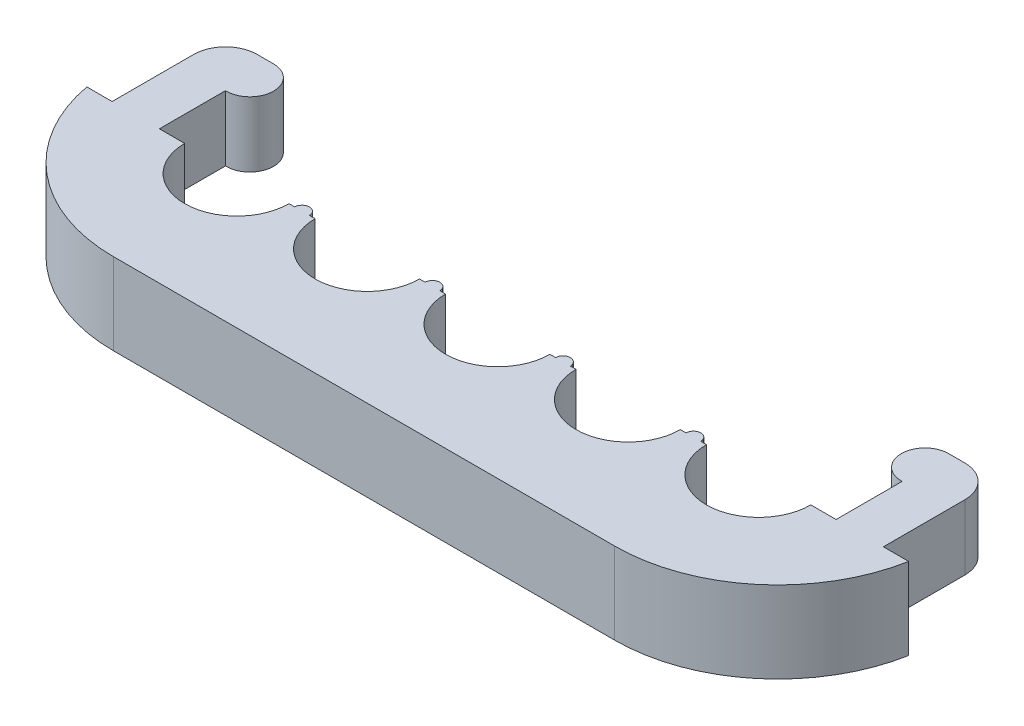
ISO-10303-21;
HEADER;
FILE_DESCRIPTION(('STEP AP214'),'2;1');
FILE_NAME('part.step','',(''),(''),'','','');
FILE_SCHEMA(('AUTOMOTIVE_DESIGN { 1 0 10303 214 1 1 1 1 }'));
ENDSEC;
DATA;
#1=APPLICATION_CONTEXT('core data for automotive mechanical design processes');
#2=APPLICATION_PROTOCOL_DEFINITION('international standard','automotive_design',2000,#1);
#3=PRODUCT_CONTEXT('',#1,'mechanical');
#4=PRODUCT('Part','Part','',(#3));
#5=PRODUCT_RELATED_PRODUCT_CATEGORY('part','',(#4));
#6=PRODUCT_DEFINITION_FORMATION('','',#4);
#7=PRODUCT_DEFINITION_CONTEXT('part definition',#1,'design');
#8=PRODUCT_DEFINITION('design','',#6,#7);
#9=PRODUCT_DEFINITION_SHAPE('','',#8);
#10=(LENGTH_UNIT() NAMED_UNIT(*) SI_UNIT(.MILLI.,.METRE.));
#11=(NAMED_UNIT(*) PLANE_ANGLE_UNIT() SI_UNIT($,.RADIAN.));
#12=(NAMED_UNIT(*) SI_UNIT($,.STERADIAN.) SOLID_ANGLE_UNIT());
#13=UNCERTAINTY_MEASURE_WITH_UNIT(LENGTH_MEASURE(1.E-05),#10,'distance_accuracy_value','');
#14=(GEOMETRIC_REPRESENTATION_CONTEXT(3) GLOBAL_UNCERTAINTY_ASSIGNED_CONTEXT((#13)) GLOBAL_UNIT_ASSIGNED_CONTEXT((#10,
#11,#12)) REPRESENTATION_CONTEXT('',''));
#15=CARTESIAN_POINT('',(0.,0.,0.));
#16=DIRECTION('',(0.,0.,1.));
#17=DIRECTION('',(1.,0.,0.));
#18=AXIS2_PLACEMENT_3D('',#15,#16,#17);
#19=CARTESIAN_POINT('',(-12.8,2.5,0.));
#20=DIRECTION('',(0.,0.,1.));
#21=DIRECTION('',(1.,0.,0.));
#22=AXIS2_PLACEMENT_3D('',#19,#20,#21);
#23=PLANE('',#22);
#24=DIRECTION('',(-1.,0.,0.));
#25=VECTOR('',#24,1.);
#26=CARTESIAN_POINT('',(-12.8,-2.5,0.));
#27=LINE('',#26,#25);
#28=CARTESIAN_POINT('',(-11.2,-2.5,0.));
#29=VERTEX_POINT('',#28);
#30=CARTESIAN_POINT('',(-11.55,-2.5,0.));
#31=VERTEX_POINT('',#30);
#32=EDGE_CURVE('E379',#29,#31,#27,.T.);
#33=ORIENTED_EDGE('',*,*,#32,.T.);
#34=DIRECTION('',(0.,1.,0.));
#35=VECTOR('',#34,1.);
#36=CARTESIAN_POINT('',(-11.55,-2.5,0.));
#37=LINE('',#36,#35);
#38=CARTESIAN_POINT('',(-11.55,2.5,0.));
#39=VERTEX_POINT('',#38);
#40=EDGE_CURVE('E454',#31,#39,#37,.T.);
#41=ORIENTED_EDGE('',*,*,#40,.T.);
#42=DIRECTION('',(-1.,0.,0.));
#43=VECTOR('',#42,1.);
#44=CARTESIAN_POINT('',(-12.8,2.5,0.));
#45=LINE('',#44,#43);
#46=CARTESIAN_POINT('',(-11.2,2.5,0.));
#47=VERTEX_POINT('',#46);
#48=EDGE_CURVE('E408',#47,#39,#45,.T.);
#49=ORIENTED_EDGE('',*,*,#48,.F.);
#50=DIRECTION('',(0.,-1.,0.));
#51=VECTOR('',#50,1.);
#52=CARTESIAN_POINT('',(-11.2,2.5,0.));
#53=LINE('',#52,#51);
#54=EDGE_CURVE('E331',#47,#29,#53,.T.);
#55=ORIENTED_EDGE('',*,*,#54,.T.);
#56=EDGE_LOOP('',(#33,#41,#49,#55));
#57=FACE_BOUND('',#56,.T.);
#58=ADVANCED_FACE('F39',(#57),#23,.F.);
#59=CARTESIAN_POINT('',(11.2,2.5,0.));
#60=DIRECTION('',(0.,0.,1.));
#61=DIRECTION('',(1.,0.,0.));
#62=AXIS2_PLACEMENT_3D('',#59,#60,#61);
#63=PLANE('',#62);
#64=DIRECTION('',(-1.,0.,0.));
#65=VECTOR('',#64,1.);
#66=CARTESIAN_POINT('',(11.2,-2.5,0.));
#67=LINE('',#66,#65);
#68=CARTESIAN_POINT('',(12.8,-2.5,0.));
#69=VERTEX_POINT('',#68);
#70=CARTESIAN_POINT('',(12.45,-2.5,0.));
#71=VERTEX_POINT('',#70);
#72=EDGE_CURVE('E274',#69,#71,#67,.T.);
#73=ORIENTED_EDGE('',*,*,#72,.T.);
#74=DIRECTION('',(0.,1.,0.));
#75=VECTOR('',#74,1.);
#76=CARTESIAN_POINT('',(12.45,-2.5,0.));
#77=LINE('',#76,#75);
#78=CARTESIAN_POINT('',(12.45,2.5,0.));
#79=VERTEX_POINT('',#78);
#80=EDGE_CURVE('E260',#71,#79,#77,.T.);
#81=ORIENTED_EDGE('',*,*,#80,.T.);
#82=DIRECTION('',(-1.,0.,0.));
#83=VECTOR('',#82,1.);
#84=CARTESIAN_POINT('',(11.2,2.5,0.));
#85=LINE('',#84,#83);
#86=CARTESIAN_POINT('',(12.8,2.5,0.));
#87=VERTEX_POINT('',#86);
#88=EDGE_CURVE('E398',#87,#79,#85,.T.);
#89=ORIENTED_EDGE('',*,*,#88,.F.);
#90=DIRECTION('',(0.,-1.,0.));
#91=VECTOR('',#90,1.);
#92=CARTESIAN_POINT('',(12.8,2.5,0.));
#93=LINE('',#92,#91);
#94=EDGE_CURVE('E283',#87,#69,#93,.T.);
#95=ORIENTED_EDGE('',*,*,#94,.T.);
#96=EDGE_LOOP('',(#73,#81,#89,#95));
#97=FACE_BOUND('',#96,.T.);
#98=ADVANCED_FACE('F276',(#97),#63,.F.);
#99=CARTESIAN_POINT('',(3.2,2.5,0.));
#100=DIRECTION('',(0.,0.,1.));
#101=DIRECTION('',(1.,0.,0.));
#102=AXIS2_PLACEMENT_3D('',#99,#100,#101);
#103=PLANE('',#102);
#104=DIRECTION('',(-1.,0.,0.));
#105=VECTOR('',#104,1.);
#106=CARTESIAN_POINT('',(3.2,-2.5,0.));
#107=LINE('',#106,#105);
#108=CARTESIAN_POINT('',(4.8,-2.5,0.));
#109=VERTEX_POINT('',#108);
#110=CARTESIAN_POINT('',(4.45,-2.5,0.));
#111=VERTEX_POINT('',#110);
#112=EDGE_CURVE('E287',#109,#111,#107,.T.);
#113=ORIENTED_EDGE('',*,*,#112,.T.);
#114=DIRECTION('',(0.,1.,0.));
#115=VECTOR('',#114,1.);
#116=CARTESIAN_POINT('',(4.45,-2.5,0.));
#117=LINE('',#116,#115);
#118=CARTESIAN_POINT('',(4.45,2.5,0.));
#119=VERTEX_POINT('',#118);
#120=EDGE_CURVE('E513',#111,#119,#117,.T.);
#121=ORIENTED_EDGE('',*,*,#120,.T.);
#122=DIRECTION('',(-1.,0.,0.));
#123=VECTOR('',#122,1.);
#124=CARTESIAN_POINT('',(3.2,2.5,0.));
#125=LINE('',#124,#123);
#126=CARTESIAN_POINT('',(4.8,2.5,0.));
#127=VERTEX_POINT('',#126);
#128=EDGE_CURVE('E392',#127,#119,#125,.T.);
#129=ORIENTED_EDGE('',*,*,#128,.F.);
#130=DIRECTION('',(0.,-1.,0.));
#131=VECTOR('',#130,1.);
#132=CARTESIAN_POINT('',(4.8,2.5,0.));
#133=LINE('',#132,#131);
#134=EDGE_CURVE('E309',#127,#109,#133,.T.);
#135=ORIENTED_EDGE('',*,*,#134,.T.);
#136=EDGE_LOOP('',(#113,#121,#129,#135));
#137=FACE_BOUND('',#136,.T.);
#138=ADVANCED_FACE('F588',(#137),#103,.F.);
#139=CARTESIAN_POINT('',(-4.8,2.5,0.));
#140=DIRECTION('',(0.,0.,1.));
#141=DIRECTION('',(1.,0.,0.));
#142=AXIS2_PLACEMENT_3D('',#139,#140,#141);
#143=PLANE('',#142);
#144=DIRECTION('',(-1.,0.,0.));
#145=VECTOR('',#144,1.);
#146=CARTESIAN_POINT('',(-4.8,-2.5,0.));
#147=LINE('',#146,#145);
#148=CARTESIAN_POINT('',(-3.2,-2.5,0.));
#149=VERTEX_POINT('',#148);
#150=CARTESIAN_POINT('',(-3.55,-2.5,0.));
#151=VERTEX_POINT('',#150);
#152=EDGE_CURVE('E298',#149,#151,#147,.T.);
#153=ORIENTED_EDGE('',*,*,#152,.T.);
#154=DIRECTION('',(0.,1.,0.));
#155=VECTOR('',#154,1.);
#156=CARTESIAN_POINT('',(-3.55,-2.5,0.));
#157=LINE('',#156,#155);
#158=CARTESIAN_POINT('',(-3.55,2.5,0.));
#159=VERTEX_POINT('',#158);
#160=EDGE_CURVE('E508',#151,#159,#157,.T.);
#161=ORIENTED_EDGE('',*,*,#160,.T.);
#162=DIRECTION('',(-1.,0.,0.));
#163=VECTOR('',#162,1.);
#164=CARTESIAN_POINT('',(-4.8,2.5,0.));
#165=LINE('',#164,#163);
#166=CARTESIAN_POINT('',(-3.2,2.5,0.));
#167=VERTEX_POINT('',#166);
#168=EDGE_CURVE('E302',#167,#159,#165,.T.);
#169=ORIENTED_EDGE('',*,*,#168,.F.);
#170=DIRECTION('',(0.,-1.,0.));
#171=VECTOR('',#170,1.);
#172=CARTESIAN_POINT('',(-3.2,2.5,0.));
#173=LINE('',#172,#171);
#174=EDGE_CURVE('E303',#167,#149,#173,.T.);
#175=ORIENTED_EDGE('',*,*,#174,.T.);
#176=EDGE_LOOP('',(#153,#161,#169,#175));
#177=FACE_BOUND('',#176,.T.);
#178=ADVANCED_FACE('F571',(#177),#143,.F.);
#179=CARTESIAN_POINT('',(-25.2,2.5,0.));
#180=DIRECTION('',(0.,0.,1.));
#181=DIRECTION('',(1.,0.,0.));
#182=AXIS2_PLACEMENT_3D('',#179,#180,#181);
#183=PLANE('',#182);
#184=DIRECTION('',(0.,1.,0.));
#185=VECTOR('',#184,1.);
#186=CARTESIAN_POINT('',(-23.65,-1.5,0.));
#187=LINE('',#186,#185);
#188=CARTESIAN_POINT('',(-23.65,-1.5,0.));
#189=VERTEX_POINT('',#188);
#190=CARTESIAN_POINT('',(-23.65,2.5,0.));
#191=VERTEX_POINT('',#190);
#192=EDGE_CURVE('E456',#189,#191,#187,.T.);
#193=ORIENTED_EDGE('',*,*,#192,.F.);
#194=DIRECTION('',(1.,0.,0.));
#195=VECTOR('',#194,1.);
#196=CARTESIAN_POINT('',(-23.65,-1.5,0.));
#197=LINE('',#196,#195);
#198=CARTESIAN_POINT('',(-20.75,-1.5,0.));
#199=VERTEX_POINT('',#198);
#200=EDGE_CURVE('E422',#189,#199,#197,.T.);
#201=ORIENTED_EDGE('',*,*,#200,.T.);
#202=DIRECTION('',(0.,1.,0.));
#203=VECTOR('',#202,1.);
#204=CARTESIAN_POINT('',(-20.75,-1.5,0.));
#205=LINE('',#204,#203);
#206=CARTESIAN_POINT('',(-20.75,2.5,0.));
#207=VERTEX_POINT('',#206);
#208=EDGE_CURVE('E459',#199,#207,#205,.T.);
#209=ORIENTED_EDGE('',*,*,#208,.T.);
#210=DIRECTION('',(-1.,0.,0.));
#211=VECTOR('',#210,1.);
#212=CARTESIAN_POINT('',(-25.2,2.5,0.));
#213=LINE('',#212,#211);
#214=CARTESIAN_POINT('',(-19.2,2.5,0.));
#215=VERTEX_POINT('',#214);
#216=EDGE_CURVE('E404',#215,#207,#213,.T.);
#217=ORIENTED_EDGE('',*,*,#216,.F.);
#218=DIRECTION('',(0.,-1.,0.));
#219=VECTOR('',#218,1.);
#220=CARTESIAN_POINT('',(-19.2,2.5,0.));
#221=LINE('',#220,#219);
#222=CARTESIAN_POINT('',(-19.2,-2.5,0.));
#223=VERTEX_POINT('',#222);
#224=EDGE_CURVE('E328',#215,#223,#221,.T.);
#225=ORIENTED_EDGE('',*,*,#224,.T.);
#226=DIRECTION('',(-1.,0.,0.));
#227=VECTOR('',#226,1.);
#228=CARTESIAN_POINT('',(-25.2,-2.5,0.));
#229=LINE('',#228,#227);
#230=CARTESIAN_POINT('',(-25.2,-2.5,0.));
#231=VERTEX_POINT('',#230);
#232=EDGE_CURVE('E373',#223,#231,#229,.T.);
#233=ORIENTED_EDGE('',*,*,#232,.T.);
#234=DIRECTION('',(0.,-1.,0.));
#235=VECTOR('',#234,1.);
#236=CARTESIAN_POINT('',(-25.2,2.5,0.));
#237=LINE('',#236,#235);
#238=CARTESIAN_POINT('',(-25.2,2.5,0.));
#239=VERTEX_POINT('',#238);
#240=EDGE_CURVE('E324',#239,#231,#237,.T.);
#241=ORIENTED_EDGE('',*,*,#240,.F.);
#242=EDGE_CURVE('E410',#191,#239,#213,.T.);
#243=ORIENTED_EDGE('',*,*,#242,.F.);
#244=EDGE_LOOP('',(#193,#201,#209,#217,#225,#233,#241,#243));
#245=FACE_BOUND('',#244,.T.);
#246=ADVANCED_FACE('F547',(#245),#183,.F.);
#247=CARTESIAN_POINT('',(19.2,2.5,0.));
#248=DIRECTION('',(0.,0.,1.));
#249=DIRECTION('',(1.,0.,0.));
#250=AXIS2_PLACEMENT_3D('',#247,#248,#249);
#251=PLANE('',#250);
#252=DIRECTION('',(0.,1.,0.));
#253=VECTOR('',#252,1.);
#254=CARTESIAN_POINT('',(20.75,-1.5,0.));
#255=LINE('',#254,#253);
#256=CARTESIAN_POINT('',(20.75,-1.5,0.));
#257=VERTEX_POINT('',#256);
#258=CARTESIAN_POINT('',(20.75,2.5,0.));
#259=VERTEX_POINT('',#258);
#260=EDGE_CURVE('E462',#257,#259,#255,.T.);
#261=ORIENTED_EDGE('',*,*,#260,.F.);
#262=DIRECTION('',(1.,0.,0.));
#263=VECTOR('',#262,1.);
#264=CARTESIAN_POINT('',(23.65,-1.5,0.));
#265=LINE('',#264,#263);
#266=CARTESIAN_POINT('',(23.65,-1.5,0.));
#267=VERTEX_POINT('',#266);
#268=EDGE_CURVE('E500',#257,#267,#265,.T.);
#269=ORIENTED_EDGE('',*,*,#268,.T.);
#270=DIRECTION('',(0.,1.,0.));
#271=VECTOR('',#270,1.);
#272=CARTESIAN_POINT('',(23.65,-1.5,0.));
#273=LINE('',#272,#271);
#274=CARTESIAN_POINT('',(23.65,2.5,0.));
#275=VERTEX_POINT('',#274);
#276=EDGE_CURVE('E365',#267,#275,#273,.T.);
#277=ORIENTED_EDGE('',*,*,#276,.T.);
#278=DIRECTION('',(-1.,0.,0.));
#279=VECTOR('',#278,1.);
#280=CARTESIAN_POINT('',(19.2,2.5,0.));
#281=LINE('',#280,#279);
#282=CARTESIAN_POINT('',(25.2,2.5,0.));
#283=VERTEX_POINT('',#282);
#284=EDGE_CURVE('E354',#283,#275,#281,.T.);
#285=ORIENTED_EDGE('',*,*,#284,.F.);
#286=DIRECTION('',(0.,-1.,0.));
#287=VECTOR('',#286,1.);
#288=CARTESIAN_POINT('',(25.2,2.5,0.));
#289=LINE('',#288,#287);
#290=CARTESIAN_POINT('',(25.2,-2.5,0.));
#291=VERTEX_POINT('',#290);
#292=EDGE_CURVE('E318',#283,#291,#289,.T.);
#293=ORIENTED_EDGE('',*,*,#292,.T.);
#294=DIRECTION('',(-1.,0.,0.));
#295=VECTOR('',#294,1.);
#296=CARTESIAN_POINT('',(19.2,-2.5,0.));
#297=LINE('',#296,#295);
#298=CARTESIAN_POINT('',(19.2,-2.5,0.));
#299=VERTEX_POINT('',#298);
#300=EDGE_CURVE('E367',#291,#299,#297,.T.);
#301=ORIENTED_EDGE('',*,*,#300,.T.);
#302=DIRECTION('',(0.,-1.,0.));
#303=VECTOR('',#302,1.);
#304=CARTESIAN_POINT('',(19.2,2.5,0.));
#305=LINE('',#304,#303);
#306=CARTESIAN_POINT('',(19.2,2.5,0.));
#307=VERTEX_POINT('',#306);
#308=EDGE_CURVE('E320',#307,#299,#305,.T.);
#309=ORIENTED_EDGE('',*,*,#308,.F.);
#310=EDGE_CURVE('E364',#259,#307,#281,.T.);
#311=ORIENTED_EDGE('',*,*,#310,.F.);
#312=EDGE_LOOP('',(#261,#269,#277,#285,#293,#301,#309,#311));
#313=FACE_BOUND('',#312,.T.);
#314=ADVANCED_FACE('F360',(#313),#251,.F.);
#315=CARTESIAN_POINT('',(-8.,2.5,0.));
#316=DIRECTION('',(0.,-1.,0.));
#317=DIRECTION('',(0.,0.,-1.));
#318=AXIS2_PLACEMENT_3D('',#315,#316,#317);
#319=CYLINDRICAL_SURFACE('',#318,3.2);
#320=CARTESIAN_POINT('',(-8.,-2.5,0.));
#321=DIRECTION('',(0.,-1.,0.));
#322=DIRECTION('',(0.,0.,1.));
#323=AXIS2_PLACEMENT_3D('',#320,#321,#322);
#324=CIRCLE('',#323,3.2);
#325=CARTESIAN_POINT('',(-4.8,-2.5,0.));
#326=VERTEX_POINT('',#325);
#327=EDGE_CURVE('E381',#326,#29,#324,.T.);
#328=ORIENTED_EDGE('',*,*,#327,.T.);
#329=ORIENTED_EDGE('',*,*,#54,.F.);
#330=CARTESIAN_POINT('',(-8.,2.5,0.));
#331=DIRECTION('',(0.,-1.,0.));
#332=DIRECTION('',(0.,0.,1.));
#333=AXIS2_PLACEMENT_3D('',#330,#331,#332);
#334=CIRCLE('',#333,3.2);
#335=CARTESIAN_POINT('',(-4.8,2.5,0.));
#336=VERTEX_POINT('',#335);
#337=EDGE_CURVE('E299',#336,#47,#334,.T.);
#338=ORIENTED_EDGE('',*,*,#337,.F.);
#339=DIRECTION('',(0.,-1.,0.));
#340=VECTOR('',#339,1.);
#341=CARTESIAN_POINT('',(-4.8,2.5,0.));
#342=LINE('',#341,#340);
#343=EDGE_CURVE('E297',#336,#326,#342,.T.);
#344=ORIENTED_EDGE('',*,*,#343,.T.);
#345=EDGE_LOOP('',(#328,#329,#338,#344));
#346=FACE_BOUND('',#345,.T.);
#347=ADVANCED_FACE('F559',(#346),#319,.F.);
#348=CARTESIAN_POINT('',(-12.45,2.5,0.));
#349=VERTEX_POINT('',#348);
#350=CARTESIAN_POINT('',(-12.8,2.5,0.));
#351=VERTEX_POINT('',#350);
#352=EDGE_CURVE('E414',#349,#351,#45,.T.);
#353=ORIENTED_EDGE('',*,*,#352,.F.);
#354=DIRECTION('',(0.,1.,0.));
#355=VECTOR('',#354,1.);
#356=CARTESIAN_POINT('',(-12.45,-2.5,0.));
#357=LINE('',#356,#355);
#358=CARTESIAN_POINT('',(-12.45,-2.5,0.));
#359=VERTEX_POINT('',#358);
#360=EDGE_CURVE('E506',#349,#359,#357,.F.);
#361=ORIENTED_EDGE('',*,*,#360,.T.);
#362=CARTESIAN_POINT('',(-12.8,-2.5,0.));
#363=VERTEX_POINT('',#362);
#364=EDGE_CURVE('E384',#359,#363,#27,.T.);
#365=ORIENTED_EDGE('',*,*,#364,.T.);
#366=DIRECTION('',(0.,-1.,0.));
#367=VECTOR('',#366,1.);
#368=CARTESIAN_POINT('',(-12.8,2.5,0.));
#369=LINE('',#368,#367);
#370=EDGE_CURVE('E330',#351,#363,#369,.T.);
#371=ORIENTED_EDGE('',*,*,#370,.F.);
#372=EDGE_LOOP('',(#353,#361,#365,#371));
#373=FACE_BOUND('',#372,.T.);
#374=ADVANCED_FACE('F536',(#373),#23,.F.);
#375=CARTESIAN_POINT('',(-16.,2.5,0.));
#376=DIRECTION('',(0.,-1.,0.));
#377=DIRECTION('',(0.,0.,-1.));
#378=AXIS2_PLACEMENT_3D('',#375,#376,#377);
#379=CYLINDRICAL_SURFACE('',#378,3.2);
#380=CARTESIAN_POINT('',(-16.,-2.5,0.));
#381=DIRECTION('',(0.,-1.,0.));
#382=DIRECTION('',(0.,0.,1.));
#383=AXIS2_PLACEMENT_3D('',#380,#381,#382);
#384=CIRCLE('',#383,3.2);
#385=EDGE_CURVE('E376',#363,#223,#384,.T.);
#386=ORIENTED_EDGE('',*,*,#385,.T.);
#387=ORIENTED_EDGE('',*,*,#224,.F.);
#388=CARTESIAN_POINT('',(-16.,2.5,0.));
#389=DIRECTION('',(0.,-1.,0.));
#390=DIRECTION('',(0.,0.,1.));
#391=AXIS2_PLACEMENT_3D('',#388,#389,#390);
#392=CIRCLE('',#391,3.2);
#393=EDGE_CURVE('E409',#351,#215,#392,.T.);
#394=ORIENTED_EDGE('',*,*,#393,.F.);
#395=ORIENTED_EDGE('',*,*,#370,.T.);
#396=EDGE_LOOP('',(#386,#387,#394,#395));
#397=FACE_BOUND('',#396,.T.);
#398=ADVANCED_FACE('F541',(#397),#379,.F.);
#399=CARTESIAN_POINT('',(25.2,2.5,8.2));
#400=DIRECTION('',(0.,0.,-1.));
#401=DIRECTION('',(-1.,0.,0.));
#402=AXIS2_PLACEMENT_3D('',#399,#400,#401);
#403=PLANE('',#402);
#404=DIRECTION('',(1.,0.,0.));
#405=VECTOR('',#404,1.);
#406=CARTESIAN_POINT('',(25.2,2.5,8.2));
#407=LINE('',#406,#405);
#408=CARTESIAN_POINT('',(-15.3633338981136,2.5,8.2));
#409=VERTEX_POINT('',#408);
#410=CARTESIAN_POINT('',(15.3633338981137,2.5,8.2));
#411=VERTEX_POINT('',#410);
#412=EDGE_CURVE('E353',#409,#411,#407,.T.);
#413=ORIENTED_EDGE('',*,*,#412,.F.);
#414=DIRECTION('',(0.,-1.,0.));
#415=VECTOR('',#414,1.);
#416=CARTESIAN_POINT('',(-15.3633338981136,2.5,8.2));
#417=LINE('',#416,#415);
#418=CARTESIAN_POINT('',(-15.3633338981136,-2.5,8.2));
#419=VERTEX_POINT('',#418);
#420=EDGE_CURVE('E340',#409,#419,#417,.T.);
#421=ORIENTED_EDGE('',*,*,#420,.T.);
#422=DIRECTION('',(1.,0.,0.));
#423=VECTOR('',#422,1.);
#424=CARTESIAN_POINT('',(25.2,-2.5,8.2));
#425=LINE('',#424,#423);
#426=CARTESIAN_POINT('',(15.3633338981137,-2.5,8.2));
#427=VERTEX_POINT('',#426);
#428=EDGE_CURVE('E368',#419,#427,#425,.T.);
#429=ORIENTED_EDGE('',*,*,#428,.T.);
#430=DIRECTION('',(0.,1.,0.));
#431=VECTOR('',#430,1.);
#432=CARTESIAN_POINT('',(15.3633338981137,2.5,8.2));
#433=LINE('',#432,#431);
#434=EDGE_CURVE('E332',#427,#411,#433,.T.);
#435=ORIENTED_EDGE('',*,*,#434,.T.);
#436=EDGE_LOOP('',(#413,#421,#429,#435));
#437=FACE_BOUND('',#436,.T.);
#438=ADVANCED_FACE('F371',(#437),#403,.F.);
#439=CARTESIAN_POINT('',(16.,2.5,0.));
#440=DIRECTION('',(0.,-1.,0.));
#441=DIRECTION('',(0.,0.,-1.));
#442=AXIS2_PLACEMENT_3D('',#439,#440,#441);
#443=CYLINDRICAL_SURFACE('',#442,3.2);
#444=CARTESIAN_POINT('',(16.,-2.5,0.));
#445=DIRECTION('',(0.,-1.,0.));
#446=DIRECTION('',(0.,0.,1.));
#447=AXIS2_PLACEMENT_3D('',#444,#445,#446);
#448=CIRCLE('',#447,3.2);
#449=EDGE_CURVE('E289',#299,#69,#448,.T.);
#450=ORIENTED_EDGE('',*,*,#449,.T.);
#451=ORIENTED_EDGE('',*,*,#94,.F.);
#452=CARTESIAN_POINT('',(16.,2.5,0.));
#453=DIRECTION('',(0.,-1.,0.));
#454=DIRECTION('',(0.,0.,1.));
#455=AXIS2_PLACEMENT_3D('',#452,#453,#454);
#456=CIRCLE('',#455,3.2);
#457=EDGE_CURVE('E361',#307,#87,#456,.T.);
#458=ORIENTED_EDGE('',*,*,#457,.F.);
#459=ORIENTED_EDGE('',*,*,#308,.T.);
#460=EDGE_LOOP('',(#450,#451,#458,#459));
#461=FACE_BOUND('',#460,.T.);
#462=ADVANCED_FACE('F600',(#461),#443,.F.);
#463=CARTESIAN_POINT('',(11.55,2.5,0.));
#464=VERTEX_POINT('',#463);
#465=CARTESIAN_POINT('',(11.2,2.5,0.));
#466=VERTEX_POINT('',#465);
#467=EDGE_CURVE('E402',#464,#466,#85,.T.);
#468=ORIENTED_EDGE('',*,*,#467,.F.);
#469=DIRECTION('',(0.,1.,0.));
#470=VECTOR('',#469,1.);
#471=CARTESIAN_POINT('',(11.55,-2.5,0.));
#472=LINE('',#471,#470);
#473=CARTESIAN_POINT('',(11.55,-2.5,0.));
#474=VERTEX_POINT('',#473);
#475=EDGE_CURVE('E269',#464,#474,#472,.F.);
#476=ORIENTED_EDGE('',*,*,#475,.T.);
#477=CARTESIAN_POINT('',(11.2,-2.5,0.));
#478=VERTEX_POINT('',#477);
#479=EDGE_CURVE('E277',#474,#478,#67,.T.);
#480=ORIENTED_EDGE('',*,*,#479,.T.);
#481=DIRECTION('',(0.,-1.,0.));
#482=VECTOR('',#481,1.);
#483=CARTESIAN_POINT('',(11.2,2.5,0.));
#484=LINE('',#483,#482);
#485=EDGE_CURVE('E312',#466,#478,#484,.T.);
#486=ORIENTED_EDGE('',*,*,#485,.F.);
#487=EDGE_LOOP('',(#468,#476,#480,#486));
#488=FACE_BOUND('',#487,.T.);
#489=ADVANCED_FACE('F595',(#488),#63,.F.);
#490=CARTESIAN_POINT('',(8.,2.5,0.));
#491=DIRECTION('',(0.,-1.,0.));
#492=DIRECTION('',(0.,0.,-1.));
#493=AXIS2_PLACEMENT_3D('',#490,#491,#492);
#494=CYLINDRICAL_SURFACE('',#493,3.2);
#495=CARTESIAN_POINT('',(8.,-2.5,0.));
#496=DIRECTION('',(0.,-1.,0.));
#497=DIRECTION('',(0.,0.,1.));
#498=AXIS2_PLACEMENT_3D('',#495,#496,#497);
#499=CIRCLE('',#498,3.2);
#500=EDGE_CURVE('E284',#478,#109,#499,.T.);
#501=ORIENTED_EDGE('',*,*,#500,.T.);
#502=ORIENTED_EDGE('',*,*,#134,.F.);
#503=CARTESIAN_POINT('',(8.,2.5,0.));
#504=DIRECTION('',(0.,-1.,0.));
#505=DIRECTION('',(0.,0.,1.));
#506=AXIS2_PLACEMENT_3D('',#503,#504,#505);
#507=CIRCLE('',#506,3.2);
#508=EDGE_CURVE('E396',#466,#127,#507,.T.);
#509=ORIENTED_EDGE('',*,*,#508,.F.);
#510=ORIENTED_EDGE('',*,*,#485,.T.);
#511=EDGE_LOOP('',(#501,#502,#509,#510));
#512=FACE_BOUND('',#511,.T.);
#513=ADVANCED_FACE('F590',(#512),#494,.F.);
#514=CARTESIAN_POINT('',(3.55,2.5,0.));
#515=VERTEX_POINT('',#514);
#516=CARTESIAN_POINT('',(3.2,2.5,0.));
#517=VERTEX_POINT('',#516);
#518=EDGE_CURVE('E399',#515,#517,#125,.T.);
#519=ORIENTED_EDGE('',*,*,#518,.F.);
#520=DIRECTION('',(0.,1.,0.));
#521=VECTOR('',#520,1.);
#522=CARTESIAN_POINT('',(3.55,-2.5,0.));
#523=LINE('',#522,#521);
#524=CARTESIAN_POINT('',(3.55,-2.5,0.));
#525=VERTEX_POINT('',#524);
#526=EDGE_CURVE('E261',#515,#525,#523,.F.);
#527=ORIENTED_EDGE('',*,*,#526,.T.);
#528=CARTESIAN_POINT('',(3.2,-2.5,0.));
#529=VERTEX_POINT('',#528);
#530=EDGE_CURVE('E285',#525,#529,#107,.T.);
#531=ORIENTED_EDGE('',*,*,#530,.T.);
#532=DIRECTION('',(0.,-1.,0.));
#533=VECTOR('',#532,1.);
#534=CARTESIAN_POINT('',(3.2,2.5,0.));
#535=LINE('',#534,#533);
#536=EDGE_CURVE('E310',#517,#529,#535,.T.);
#537=ORIENTED_EDGE('',*,*,#536,.F.);
#538=EDGE_LOOP('',(#519,#527,#531,#537));
#539=FACE_BOUND('',#538,.T.);
#540=ADVANCED_FACE('F578',(#539),#103,.F.);
#541=CARTESIAN_POINT('',(0.,2.5,0.));
#542=DIRECTION('',(0.,-1.,0.));
#543=DIRECTION('',(0.,0.,-1.));
#544=AXIS2_PLACEMENT_3D('',#541,#542,#543);
#545=CYLINDRICAL_SURFACE('',#544,3.2);
#546=CARTESIAN_POINT('',(0.,-2.5,0.));
#547=DIRECTION('',(0.,-1.,0.));
#548=DIRECTION('',(0.,0.,1.));
#549=AXIS2_PLACEMENT_3D('',#546,#547,#548);
#550=CIRCLE('',#549,3.2);
#551=EDGE_CURVE('E291',#529,#149,#550,.T.);
#552=ORIENTED_EDGE('',*,*,#551,.T.);
#553=ORIENTED_EDGE('',*,*,#174,.F.);
#554=CARTESIAN_POINT('',(0.,2.5,0.));
#555=DIRECTION('',(0.,-1.,0.));
#556=DIRECTION('',(0.,0.,1.));
#557=AXIS2_PLACEMENT_3D('',#554,#555,#556);
#558=CIRCLE('',#557,3.2);
#559=EDGE_CURVE('E393',#517,#167,#558,.T.);
#560=ORIENTED_EDGE('',*,*,#559,.F.);
#561=ORIENTED_EDGE('',*,*,#536,.T.);
#562=EDGE_LOOP('',(#552,#553,#560,#561));
#563=FACE_BOUND('',#562,.T.);
#564=ADVANCED_FACE('F577',(#563),#545,.F.);
#565=CARTESIAN_POINT('',(-4.45,2.5,0.));
#566=VERTEX_POINT('',#565);
#567=EDGE_CURVE('E388',#566,#336,#165,.T.);
#568=ORIENTED_EDGE('',*,*,#567,.F.);
#569=DIRECTION('',(0.,1.,0.));
#570=VECTOR('',#569,1.);
#571=CARTESIAN_POINT('',(-4.45,-2.5,0.));
#572=LINE('',#571,#570);
#573=CARTESIAN_POINT('',(-4.45,-2.5,0.));
#574=VERTEX_POINT('',#573);
#575=EDGE_CURVE('E515',#566,#574,#572,.F.);
#576=ORIENTED_EDGE('',*,*,#575,.T.);
#577=EDGE_CURVE('E294',#574,#326,#147,.T.);
#578=ORIENTED_EDGE('',*,*,#577,.T.);
#579=ORIENTED_EDGE('',*,*,#343,.F.);
#580=EDGE_LOOP('',(#568,#576,#578,#579));
#581=FACE_BOUND('',#580,.T.);
#582=ADVANCED_FACE('F562',(#581),#143,.F.);
#583=CARTESIAN_POINT('',(-8.,2.5,0.));
#584=DIRECTION('',(0.,1.,0.));
#585=DIRECTION('',(0.,0.,1.));
#586=AXIS2_PLACEMENT_3D('',#583,#584,#585);
#587=PLANE('',#586);
#588=ORIENTED_EDGE('',*,*,#48,.T.);
#589=CARTESIAN_POINT('',(-12.,2.5,0.));
#590=DIRECTION('',(0.,1.,0.));
#591=DIRECTION('',(0.,0.,1.));
#592=AXIS2_PLACEMENT_3D('',#589,#590,#591);
#593=CIRCLE('',#592,0.45);
#594=EDGE_CURVE('E532',#39,#349,#593,.T.);
#595=ORIENTED_EDGE('',*,*,#594,.T.);
#596=ORIENTED_EDGE('',*,*,#352,.T.);
#597=ORIENTED_EDGE('',*,*,#393,.T.);
#598=ORIENTED_EDGE('',*,*,#216,.T.);
#599=DIRECTION('',(0.,0.,-1.));
#600=VECTOR('',#599,1.);
#601=CARTESIAN_POINT('',(-20.75,2.5,-4.05086232538106));
#602=LINE('',#601,#600);
#603=CARTESIAN_POINT('',(-20.75,2.5,-4.05086232538106));
#604=VERTEX_POINT('',#603);
#605=EDGE_CURVE('E445',#207,#604,#602,.T.);
#606=ORIENTED_EDGE('',*,*,#605,.T.);
#607=CARTESIAN_POINT('',(-20.7,2.5,-5.5));
#608=DIRECTION('',(0.,1.,0.));
#609=DIRECTION('',(0.,0.,-1.));
#610=AXIS2_PLACEMENT_3D('',#607,#608,#609);
#611=CIRCLE('',#610,1.45);
#612=CARTESIAN_POINT('',(-20.7,2.5,-6.95));
#613=VERTEX_POINT('',#612);
#614=EDGE_CURVE('E444',#604,#613,#611,.T.);
#615=ORIENTED_EDGE('',*,*,#614,.T.);
#616=DIRECTION('',(-1.,0.,0.));
#617=VECTOR('',#616,1.);
#618=CARTESIAN_POINT('',(-21.7,2.5,-6.95));
#619=LINE('',#618,#617);
#620=CARTESIAN_POINT('',(-21.7,2.5,-6.95));
#621=VERTEX_POINT('',#620);
#622=EDGE_CURVE('E420',#613,#621,#619,.T.);
#623=ORIENTED_EDGE('',*,*,#622,.T.);
#624=CARTESIAN_POINT('',(-21.7,2.5,-5.));
#625=DIRECTION('',(0.,1.,0.));
#626=DIRECTION('',(0.,0.,-1.));
#627=AXIS2_PLACEMENT_3D('',#624,#625,#626);
#628=CIRCLE('',#627,1.95);
#629=CARTESIAN_POINT('',(-23.65,2.5,-4.99999999999999));
#630=VERTEX_POINT('',#629);
#631=EDGE_CURVE('E434',#621,#630,#628,.T.);
#632=ORIENTED_EDGE('',*,*,#631,.T.);
#633=DIRECTION('',(0.,0.,1.));
#634=VECTOR('',#633,1.);
#635=CARTESIAN_POINT('',(-23.65,2.5,-4.99999999999999));
#636=LINE('',#635,#634);
#637=EDGE_CURVE('E437',#630,#191,#636,.T.);
#638=ORIENTED_EDGE('',*,*,#637,.T.);
#639=ORIENTED_EDGE('',*,*,#242,.T.);
#640=CARTESIAN_POINT('',(-15.3633338981137,2.5,-1.8));
#641=DIRECTION('',(0.,1.,0.));
#642=DIRECTION('',(0.,0.,1.));
#643=AXIS2_PLACEMENT_3D('',#640,#641,#642);
#644=CIRCLE('',#643,10.);
#645=EDGE_CURVE('E11',#239,#409,#644,.T.);
#646=ORIENTED_EDGE('',*,*,#645,.T.);
#647=ORIENTED_EDGE('',*,*,#412,.T.);
#648=CARTESIAN_POINT('',(15.3633338981137,2.5,-1.8));
#649=DIRECTION('',(0.,1.,0.));
#650=DIRECTION('',(0.,0.,1.));
#651=AXIS2_PLACEMENT_3D('',#648,#649,#650);
#652=CIRCLE('',#651,10.);
#653=EDGE_CURVE('E50',#411,#283,#652,.T.);
#654=ORIENTED_EDGE('',*,*,#653,.T.);
#655=ORIENTED_EDGE('',*,*,#284,.T.);
#656=DIRECTION('',(0.,0.,-1.));
#657=VECTOR('',#656,1.);
#658=CARTESIAN_POINT('',(23.65,2.5,-4.99999999999999));
#659=LINE('',#658,#657);
#660=CARTESIAN_POINT('',(23.65,2.5,-4.99999999999999));
#661=VERTEX_POINT('',#660);
#662=EDGE_CURVE('E481',#275,#661,#659,.T.);
#663=ORIENTED_EDGE('',*,*,#662,.T.);
#664=CARTESIAN_POINT('',(21.7,2.5,-5.));
#665=DIRECTION('',(0.,1.,0.));
#666=DIRECTION('',(0.,0.,1.));
#667=AXIS2_PLACEMENT_3D('',#664,#665,#666);
#668=CIRCLE('',#667,1.95);
#669=CARTESIAN_POINT('',(21.7,2.5,-6.95));
#670=VERTEX_POINT('',#669);
#671=EDGE_CURVE('E480',#661,#670,#668,.T.);
#672=ORIENTED_EDGE('',*,*,#671,.T.);
#673=DIRECTION('',(-1.,0.,0.));
#674=VECTOR('',#673,1.);
#675=CARTESIAN_POINT('',(21.7,2.5,-6.95));
#676=LINE('',#675,#674);
#677=CARTESIAN_POINT('',(20.7,2.5,-6.95));
#678=VERTEX_POINT('',#677);
#679=EDGE_CURVE('E473',#670,#678,#676,.T.);
#680=ORIENTED_EDGE('',*,*,#679,.T.);
#681=CARTESIAN_POINT('',(20.7,2.5,-5.5));
#682=DIRECTION('',(0.,1.,0.));
#683=DIRECTION('',(0.,0.,1.));
#684=AXIS2_PLACEMENT_3D('',#681,#682,#683);
#685=CIRCLE('',#684,1.45);
#686=CARTESIAN_POINT('',(20.75,2.5,-4.05086232538106));
#687=VERTEX_POINT('',#686);
#688=EDGE_CURVE('E438',#678,#687,#685,.T.);
#689=ORIENTED_EDGE('',*,*,#688,.T.);
#690=DIRECTION('',(0.,0.,1.));
#691=VECTOR('',#690,1.);
#692=CARTESIAN_POINT('',(20.75,2.5,-4.05086232538106));
#693=LINE('',#692,#691);
#694=EDGE_CURVE('E483',#687,#259,#693,.T.);
#695=ORIENTED_EDGE('',*,*,#694,.T.);
#696=ORIENTED_EDGE('',*,*,#310,.T.);
#697=ORIENTED_EDGE('',*,*,#457,.T.);
#698=ORIENTED_EDGE('',*,*,#88,.T.);
#699=CARTESIAN_POINT('',(12.,2.5,0.));
#700=DIRECTION('',(0.,1.,0.));
#701=DIRECTION('',(0.,0.,1.));
#702=AXIS2_PLACEMENT_3D('',#699,#700,#701);
#703=CIRCLE('',#702,0.45);
#704=EDGE_CURVE('E258',#79,#464,#703,.T.);
#705=ORIENTED_EDGE('',*,*,#704,.T.);
#706=ORIENTED_EDGE('',*,*,#467,.T.);
#707=ORIENTED_EDGE('',*,*,#508,.T.);
#708=ORIENTED_EDGE('',*,*,#128,.T.);
#709=CARTESIAN_POINT('',(4.,2.5,0.));
#710=DIRECTION('',(0.,1.,0.));
#711=DIRECTION('',(0.,0.,1.));
#712=AXIS2_PLACEMENT_3D('',#709,#710,#711);
#713=CIRCLE('',#712,0.45);
#714=EDGE_CURVE('E522',#119,#515,#713,.T.);
#715=ORIENTED_EDGE('',*,*,#714,.T.);
#716=ORIENTED_EDGE('',*,*,#518,.T.);
#717=ORIENTED_EDGE('',*,*,#559,.T.);
#718=ORIENTED_EDGE('',*,*,#168,.T.);
#719=CARTESIAN_POINT('',(-4.,2.5,0.));
#720=DIRECTION('',(0.,1.,0.));
#721=DIRECTION('',(0.,0.,1.));
#722=AXIS2_PLACEMENT_3D('',#719,#720,#721);
#723=CIRCLE('',#722,0.45);
#724=EDGE_CURVE('E530',#159,#566,#723,.T.);
#725=ORIENTED_EDGE('',*,*,#724,.T.);
#726=ORIENTED_EDGE('',*,*,#567,.T.);
#727=ORIENTED_EDGE('',*,*,#337,.T.);
#728=EDGE_LOOP('',(#588,#595,#596,#597,#598,#606,#615,#623,#632,#638,#639,#646,#647,#654,#655,
#663,#672,#680,#689,#695,#696,#697,#698,#705,#706,#707,#708,#715,#716,#717,#718,#725,#726,#727));
#729=FACE_BOUND('',#728,.T.);
#730=ADVANCED_FACE('F350',(#729),#587,.T.);
#731=CARTESIAN_POINT('',(-8.,-2.5,0.));
#732=DIRECTION('',(0.,1.,0.));
#733=DIRECTION('',(0.,0.,1.));
#734=AXIS2_PLACEMENT_3D('',#731,#732,#733);
#735=PLANE('',#734);
#736=ORIENTED_EDGE('',*,*,#364,.F.);
#737=CARTESIAN_POINT('',(-12.,-2.5,0.));
#738=DIRECTION('',(0.,1.,0.));
#739=DIRECTION('',(0.,0.,1.));
#740=AXIS2_PLACEMENT_3D('',#737,#738,#739);
#741=CIRCLE('',#740,0.45);
#742=EDGE_CURVE('E516',#31,#359,#741,.T.);
#743=ORIENTED_EDGE('',*,*,#742,.F.);
#744=ORIENTED_EDGE('',*,*,#32,.F.);
#745=ORIENTED_EDGE('',*,*,#327,.F.);
#746=ORIENTED_EDGE('',*,*,#577,.F.);
#747=CARTESIAN_POINT('',(-4.,-2.5,0.));
#748=DIRECTION('',(0.,1.,0.));
#749=DIRECTION('',(0.,0.,1.));
#750=AXIS2_PLACEMENT_3D('',#747,#748,#749);
#751=CIRCLE('',#750,0.45);
#752=EDGE_CURVE('E529',#151,#574,#751,.T.);
#753=ORIENTED_EDGE('',*,*,#752,.F.);
#754=ORIENTED_EDGE('',*,*,#152,.F.);
#755=ORIENTED_EDGE('',*,*,#551,.F.);
#756=ORIENTED_EDGE('',*,*,#530,.F.);
#757=CARTESIAN_POINT('',(4.,-2.5,0.));
#758=DIRECTION('',(0.,1.,0.));
#759=DIRECTION('',(0.,0.,1.));
#760=AXIS2_PLACEMENT_3D('',#757,#758,#759);
#761=CIRCLE('',#760,0.45);
#762=EDGE_CURVE('E65',#111,#525,#761,.T.);
#763=ORIENTED_EDGE('',*,*,#762,.F.);
#764=ORIENTED_EDGE('',*,*,#112,.F.);
#765=ORIENTED_EDGE('',*,*,#500,.F.);
#766=ORIENTED_EDGE('',*,*,#479,.F.);
#767=CARTESIAN_POINT('',(12.,-2.5,0.));
#768=DIRECTION('',(0.,1.,0.));
#769=DIRECTION('',(0.,0.,1.));
#770=AXIS2_PLACEMENT_3D('',#767,#768,#769);
#771=CIRCLE('',#770,0.45);
#772=EDGE_CURVE('E53',#71,#474,#771,.T.);
#773=ORIENTED_EDGE('',*,*,#772,.F.);
#774=ORIENTED_EDGE('',*,*,#72,.F.);
#775=ORIENTED_EDGE('',*,*,#449,.F.);
#776=ORIENTED_EDGE('',*,*,#300,.F.);
#777=CARTESIAN_POINT('',(15.3633338981137,-2.5,-1.8));
#778=DIRECTION('',(0.,1.,0.));
#779=DIRECTION('',(0.,0.,1.));
#780=AXIS2_PLACEMENT_3D('',#777,#778,#779);
#781=CIRCLE('',#780,10.);
#782=EDGE_CURVE('E338',#291,#427,#781,.F.);
#783=ORIENTED_EDGE('',*,*,#782,.T.);
#784=ORIENTED_EDGE('',*,*,#428,.F.);
#785=CARTESIAN_POINT('',(-15.3633338981137,-2.5,-1.8));
#786=DIRECTION('',(0.,1.,0.));
#787=DIRECTION('',(0.,0.,1.));
#788=AXIS2_PLACEMENT_3D('',#785,#786,#787);
#789=CIRCLE('',#788,10.);
#790=EDGE_CURVE('E345',#419,#231,#789,.F.);
#791=ORIENTED_EDGE('',*,*,#790,.T.);
#792=ORIENTED_EDGE('',*,*,#232,.F.);
#793=ORIENTED_EDGE('',*,*,#385,.F.);
#794=EDGE_LOOP('',(#736,#743,#744,#745,#746,#753,#754,#755,#756,#763,#764,#765,#766,#773,#774,
#775,#776,#783,#784,#791,#792,#793));
#795=FACE_BOUND('',#794,.T.);
#796=ADVANCED_FACE('F275',(#795),#735,.F.);
#797=CARTESIAN_POINT('',(20.7,-1.5,-5.5));
#798=DIRECTION('',(0.,1.,0.));
#799=DIRECTION('',(0.,0.,1.));
#800=AXIS2_PLACEMENT_3D('',#797,#798,#799);
#801=CYLINDRICAL_SURFACE('',#800,1.45);
#802=ORIENTED_EDGE('',*,*,#688,.F.);
#803=DIRECTION('',(0.,1.,0.));
#804=VECTOR('',#803,1.);
#805=CARTESIAN_POINT('',(20.7,-1.5,-6.95));
#806=LINE('',#805,#804);
#807=CARTESIAN_POINT('',(20.7,-1.5,-6.95));
#808=VERTEX_POINT('',#807);
#809=EDGE_CURVE('E390',#808,#678,#806,.T.);
#810=ORIENTED_EDGE('',*,*,#809,.F.);
#811=CARTESIAN_POINT('',(20.7,-1.5,-5.5));
#812=DIRECTION('',(0.,1.,0.));
#813=DIRECTION('',(0.,0.,1.));
#814=AXIS2_PLACEMENT_3D('',#811,#812,#813);
#815=CIRCLE('',#814,1.45);
#816=CARTESIAN_POINT('',(20.75,-1.5,-4.05086232538106));
#817=VERTEX_POINT('',#816);
#818=EDGE_CURVE('E477',#808,#817,#815,.T.);
#819=ORIENTED_EDGE('',*,*,#818,.T.);
#820=DIRECTION('',(0.,1.,0.));
#821=VECTOR('',#820,1.);
#822=CARTESIAN_POINT('',(20.75,-1.5,-4.05086232538106));
#823=LINE('',#822,#821);
#824=EDGE_CURVE('E465',#817,#687,#823,.T.);
#825=ORIENTED_EDGE('',*,*,#824,.T.);
#826=EDGE_LOOP('',(#802,#810,#819,#825));
#827=FACE_BOUND('',#826,.T.);
#828=ADVANCED_FACE('F608',(#827),#801,.T.);
#829=CARTESIAN_POINT('',(21.7,-1.5,-6.95));
#830=DIRECTION('',(0.,0.,-1.));
#831=DIRECTION('',(-1.,0.,0.));
#832=AXIS2_PLACEMENT_3D('',#829,#830,#831);
#833=PLANE('',#832);
#834=ORIENTED_EDGE('',*,*,#679,.F.);
#835=DIRECTION('',(0.,1.,0.));
#836=VECTOR('',#835,1.);
#837=CARTESIAN_POINT('',(21.7,-1.5,-6.95));
#838=LINE('',#837,#836);
#839=CARTESIAN_POINT('',(21.7,-1.5,-6.95));
#840=VERTEX_POINT('',#839);
#841=EDGE_CURVE('E475',#840,#670,#838,.T.);
#842=ORIENTED_EDGE('',*,*,#841,.F.);
#843=DIRECTION('',(-1.,0.,0.));
#844=VECTOR('',#843,1.);
#845=CARTESIAN_POINT('',(21.7,-1.5,-6.95));
#846=LINE('',#845,#844);
#847=EDGE_CURVE('E467',#840,#808,#846,.T.);
#848=ORIENTED_EDGE('',*,*,#847,.T.);
#849=ORIENTED_EDGE('',*,*,#809,.T.);
#850=EDGE_LOOP('',(#834,#842,#848,#849));
#851=FACE_BOUND('',#850,.T.);
#852=ADVANCED_FACE('F616',(#851),#833,.T.);
#853=CARTESIAN_POINT('',(21.7,-1.5,-5.));
#854=DIRECTION('',(0.,1.,0.));
#855=DIRECTION('',(0.,0.,1.));
#856=AXIS2_PLACEMENT_3D('',#853,#854,#855);
#857=CYLINDRICAL_SURFACE('',#856,1.95);
#858=ORIENTED_EDGE('',*,*,#671,.F.);
#859=DIRECTION('',(0.,1.,0.));
#860=VECTOR('',#859,1.);
#861=CARTESIAN_POINT('',(23.65,-1.5,-4.99999999999999));
#862=LINE('',#861,#860);
#863=CARTESIAN_POINT('',(23.65,-1.5,-4.99999999999999));
#864=VERTEX_POINT('',#863);
#865=EDGE_CURVE('E468',#864,#661,#862,.T.);
#866=ORIENTED_EDGE('',*,*,#865,.F.);
#867=CARTESIAN_POINT('',(21.7,-1.5,-5.));
#868=DIRECTION('',(0.,1.,0.));
#869=DIRECTION('',(0.,0.,1.));
#870=AXIS2_PLACEMENT_3D('',#867,#868,#869);
#871=CIRCLE('',#870,1.95);
#872=EDGE_CURVE('E493',#864,#840,#871,.T.);
#873=ORIENTED_EDGE('',*,*,#872,.T.);
#874=ORIENTED_EDGE('',*,*,#841,.T.);
#875=EDGE_LOOP('',(#858,#866,#873,#874));
#876=FACE_BOUND('',#875,.T.);
#877=ADVANCED_FACE('F620',(#876),#857,.T.);
#878=CARTESIAN_POINT('',(23.65,-1.5,-4.99999999999999));
#879=DIRECTION('',(1.,0.,0.));
#880=DIRECTION('',(0.,0.,-1.));
#881=AXIS2_PLACEMENT_3D('',#878,#879,#880);
#882=PLANE('',#881);
#883=ORIENTED_EDGE('',*,*,#662,.F.);
#884=ORIENTED_EDGE('',*,*,#276,.F.);
#885=DIRECTION('',(0.,0.,-1.));
#886=VECTOR('',#885,1.);
#887=CARTESIAN_POINT('',(23.65,-1.5,-4.99999999999999));
#888=LINE('',#887,#886);
#889=EDGE_CURVE('E494',#267,#864,#888,.T.);
#890=ORIENTED_EDGE('',*,*,#889,.T.);
#891=ORIENTED_EDGE('',*,*,#865,.T.);
#892=EDGE_LOOP('',(#883,#884,#890,#891));
#893=FACE_BOUND('',#892,.T.);
#894=ADVANCED_FACE('F613',(#893),#882,.T.);
#895=CARTESIAN_POINT('',(20.75,-1.5,-4.05086232538106));
#896=DIRECTION('',(-1.,0.,0.));
#897=DIRECTION('',(0.,0.,1.));
#898=AXIS2_PLACEMENT_3D('',#895,#896,#897);
#899=PLANE('',#898);
#900=ORIENTED_EDGE('',*,*,#694,.F.);
#901=ORIENTED_EDGE('',*,*,#824,.F.);
#902=DIRECTION('',(0.,0.,1.));
#903=VECTOR('',#902,1.);
#904=CARTESIAN_POINT('',(20.75,-1.5,-4.05086232538106));
#905=LINE('',#904,#903);
#906=EDGE_CURVE('E497',#817,#257,#905,.T.);
#907=ORIENTED_EDGE('',*,*,#906,.T.);
#908=ORIENTED_EDGE('',*,*,#260,.T.);
#909=EDGE_LOOP('',(#900,#901,#907,#908));
#910=FACE_BOUND('',#909,.T.);
#911=ADVANCED_FACE('F602',(#910),#899,.T.);
#912=CARTESIAN_POINT('',(20.7,-1.5,-5.5));
#913=DIRECTION('',(0.,1.,0.));
#914=DIRECTION('',(0.,0.,1.));
#915=AXIS2_PLACEMENT_3D('',#912,#913,#914);
#916=PLANE('',#915);
#917=ORIENTED_EDGE('',*,*,#818,.F.);
#918=ORIENTED_EDGE('',*,*,#847,.F.);
#919=ORIENTED_EDGE('',*,*,#872,.F.);
#920=ORIENTED_EDGE('',*,*,#889,.F.);
#921=ORIENTED_EDGE('',*,*,#268,.F.);
#922=ORIENTED_EDGE('',*,*,#906,.F.);
#923=EDGE_LOOP('',(#917,#918,#919,#920,#921,#922));
#924=FACE_BOUND('',#923,.T.);
#925=ADVANCED_FACE('F610',(#924),#916,.F.);
#926=CARTESIAN_POINT('',(-21.7,-1.5,-5.));
#927=DIRECTION('',(0.,1.,0.));
#928=DIRECTION('',(0.,0.,1.));
#929=AXIS2_PLACEMENT_3D('',#926,#927,#928);
#930=CYLINDRICAL_SURFACE('',#929,1.95);
#931=ORIENTED_EDGE('',*,*,#631,.F.);
#932=DIRECTION('',(0.,1.,0.));
#933=VECTOR('',#932,1.);
#934=CARTESIAN_POINT('',(-21.7,-1.5,-6.95));
#935=LINE('',#934,#933);
#936=CARTESIAN_POINT('',(-21.7,-1.5,-6.95));
#937=VERTEX_POINT('',#936);
#938=EDGE_CURVE('E448',#937,#621,#935,.T.);
#939=ORIENTED_EDGE('',*,*,#938,.F.);
#940=CARTESIAN_POINT('',(-21.7,-1.5,-5.));
#941=DIRECTION('',(0.,1.,0.));
#942=DIRECTION('',(0.,0.,-1.));
#943=AXIS2_PLACEMENT_3D('',#940,#941,#942);
#944=CIRCLE('',#943,1.95);
#945=CARTESIAN_POINT('',(-23.65,-1.5,-4.99999999999999));
#946=VERTEX_POINT('',#945);
#947=EDGE_CURVE('E411',#937,#946,#944,.T.);
#948=ORIENTED_EDGE('',*,*,#947,.T.);
#949=DIRECTION('',(0.,1.,0.));
#950=VECTOR('',#949,1.);
#951=CARTESIAN_POINT('',(-23.65,-1.5,-4.99999999999999));
#952=LINE('',#951,#950);
#953=EDGE_CURVE('E432',#946,#630,#952,.T.);
#954=ORIENTED_EDGE('',*,*,#953,.T.);
#955=EDGE_LOOP('',(#931,#939,#948,#954));
#956=FACE_BOUND('',#955,.T.);
#957=ADVANCED_FACE('F669',(#956),#930,.T.);
#958=CARTESIAN_POINT('',(-21.7,-1.5,-6.95));
#959=DIRECTION('',(0.,0.,-1.));
#960=DIRECTION('',(-1.,0.,0.));
#961=AXIS2_PLACEMENT_3D('',#958,#959,#960);
#962=PLANE('',#961);
#963=ORIENTED_EDGE('',*,*,#622,.F.);
#964=DIRECTION('',(0.,1.,0.));
#965=VECTOR('',#964,1.);
#966=CARTESIAN_POINT('',(-20.7,-1.5,-6.95));
#967=LINE('',#966,#965);
#968=CARTESIAN_POINT('',(-20.7,-1.5,-6.95));
#969=VERTEX_POINT('',#968);
#970=EDGE_CURVE('E455',#969,#613,#967,.T.);
#971=ORIENTED_EDGE('',*,*,#970,.F.);
#972=DIRECTION('',(-1.,0.,0.));
#973=VECTOR('',#972,1.);
#974=CARTESIAN_POINT('',(-21.7,-1.5,-6.95));
#975=LINE('',#974,#973);
#976=EDGE_CURVE('E431',#969,#937,#975,.T.);
#977=ORIENTED_EDGE('',*,*,#976,.T.);
#978=ORIENTED_EDGE('',*,*,#938,.T.);
#979=EDGE_LOOP('',(#963,#971,#977,#978));
#980=FACE_BOUND('',#979,.T.);
#981=ADVANCED_FACE('F673',(#980),#962,.T.);
#982=CARTESIAN_POINT('',(-20.7,-1.5,-5.5));
#983=DIRECTION('',(0.,1.,0.));
#984=DIRECTION('',(0.,0.,1.));
#985=AXIS2_PLACEMENT_3D('',#982,#983,#984);
#986=CYLINDRICAL_SURFACE('',#985,1.45);
#987=ORIENTED_EDGE('',*,*,#614,.F.);
#988=DIRECTION('',(0.,1.,0.));
#989=VECTOR('',#988,1.);
#990=CARTESIAN_POINT('',(-20.75,-1.5,-4.05086232538106));
#991=LINE('',#990,#989);
#992=CARTESIAN_POINT('',(-20.75,-1.5,-4.05086232538106));
#993=VERTEX_POINT('',#992);
#994=EDGE_CURVE('E453',#993,#604,#991,.T.);
#995=ORIENTED_EDGE('',*,*,#994,.F.);
#996=CARTESIAN_POINT('',(-20.7,-1.5,-5.5));
#997=DIRECTION('',(0.,1.,0.));
#998=DIRECTION('',(0.,0.,-1.));
#999=AXIS2_PLACEMENT_3D('',#996,#997,#998);
#1000=CIRCLE('',#999,1.45);
#1001=EDGE_CURVE('E426',#993,#969,#1000,.T.);
#1002=ORIENTED_EDGE('',*,*,#1001,.T.);
#1003=ORIENTED_EDGE('',*,*,#970,.T.);
#1004=EDGE_LOOP('',(#987,#995,#1002,#1003));
#1005=FACE_BOUND('',#1004,.T.);
#1006=ADVANCED_FACE('F676',(#1005),#986,.T.);
#1007=CARTESIAN_POINT('',(-20.75,-1.5,-4.05086232538106));
#1008=DIRECTION('',(1.,0.,0.));
#1009=DIRECTION('',(0.,0.,-1.));
#1010=AXIS2_PLACEMENT_3D('',#1007,#1008,#1009);
#1011=PLANE('',#1010);
#1012=ORIENTED_EDGE('',*,*,#605,.F.);
#1013=ORIENTED_EDGE('',*,*,#208,.F.);
#1014=DIRECTION('',(0.,0.,-1.));
#1015=VECTOR('',#1014,1.);
#1016=CARTESIAN_POINT('',(-20.75,-1.5,-4.05086232538106));
#1017=LINE('',#1016,#1015);
#1018=EDGE_CURVE('E424',#199,#993,#1017,.T.);
#1019=ORIENTED_EDGE('',*,*,#1018,.T.);
#1020=ORIENTED_EDGE('',*,*,#994,.T.);
#1021=EDGE_LOOP('',(#1012,#1013,#1019,#1020));
#1022=FACE_BOUND('',#1021,.T.);
#1023=ADVANCED_FACE('F671',(#1022),#1011,.T.);
#1024=CARTESIAN_POINT('',(-23.65,-1.5,-4.99999999999999));
#1025=DIRECTION('',(-1.,0.,0.));
#1026=DIRECTION('',(0.,0.,1.));
#1027=AXIS2_PLACEMENT_3D('',#1024,#1025,#1026);
#1028=PLANE('',#1027);
#1029=ORIENTED_EDGE('',*,*,#637,.F.);
#1030=ORIENTED_EDGE('',*,*,#953,.F.);
#1031=DIRECTION('',(0.,0.,1.));
#1032=VECTOR('',#1031,1.);
#1033=CARTESIAN_POINT('',(-23.65,-1.5,-4.99999999999999));
#1034=LINE('',#1033,#1032);
#1035=EDGE_CURVE('E418',#946,#189,#1034,.T.);
#1036=ORIENTED_EDGE('',*,*,#1035,.T.);
#1037=ORIENTED_EDGE('',*,*,#192,.T.);
#1038=EDGE_LOOP('',(#1029,#1030,#1036,#1037));
#1039=FACE_BOUND('',#1038,.T.);
#1040=ADVANCED_FACE('F659',(#1039),#1028,.T.);
#1041=CARTESIAN_POINT('',(-21.7,-1.5,-5.));
#1042=DIRECTION('',(0.,-1.,0.));
#1043=DIRECTION('',(0.,0.,-1.));
#1044=AXIS2_PLACEMENT_3D('',#1041,#1042,#1043);
#1045=PLANE('',#1044);
#1046=ORIENTED_EDGE('',*,*,#947,.F.);
#1047=ORIENTED_EDGE('',*,*,#976,.F.);
#1048=ORIENTED_EDGE('',*,*,#1001,.F.);
#1049=ORIENTED_EDGE('',*,*,#1018,.F.);
#1050=ORIENTED_EDGE('',*,*,#200,.F.);
#1051=ORIENTED_EDGE('',*,*,#1035,.F.);
#1052=EDGE_LOOP('',(#1046,#1047,#1048,#1049,#1050,#1051));
#1053=FACE_BOUND('',#1052,.T.);
#1054=ADVANCED_FACE('F648',(#1053),#1045,.T.);
#1055=CARTESIAN_POINT('',(-15.3633338981137,2.5,-1.8));
#1056=DIRECTION('',(0.,-1.,0.));
#1057=DIRECTION('',(0.,0.,-1.));
#1058=AXIS2_PLACEMENT_3D('',#1055,#1056,#1057);
#1059=CYLINDRICAL_SURFACE('',#1058,10.);
#1060=ORIENTED_EDGE('',*,*,#645,.F.);
#1061=ORIENTED_EDGE('',*,*,#240,.T.);
#1062=ORIENTED_EDGE('',*,*,#790,.F.);
#1063=ORIENTED_EDGE('',*,*,#420,.F.);
#1064=EDGE_LOOP('',(#1060,#1061,#1062,#1063));
#1065=FACE_BOUND('',#1064,.T.);
#1066=ADVANCED_FACE('F649',(#1065),#1059,.T.);
#1067=CARTESIAN_POINT('',(15.3633338981137,2.5,-1.8));
#1068=DIRECTION('',(0.,1.,0.));
#1069=DIRECTION('',(0.,0.,1.));
#1070=AXIS2_PLACEMENT_3D('',#1067,#1068,#1069);
#1071=CYLINDRICAL_SURFACE('',#1070,10.);
#1072=ORIENTED_EDGE('',*,*,#653,.F.);
#1073=ORIENTED_EDGE('',*,*,#434,.F.);
#1074=ORIENTED_EDGE('',*,*,#782,.F.);
#1075=ORIENTED_EDGE('',*,*,#292,.F.);
#1076=EDGE_LOOP('',(#1072,#1073,#1074,#1075));
#1077=FACE_BOUND('',#1076,.T.);
#1078=ADVANCED_FACE('F41',(#1077),#1071,.T.);
#1079=CARTESIAN_POINT('',(-4.,-2.5,0.));
#1080=DIRECTION('',(0.,1.,0.));
#1081=DIRECTION('',(0.,0.,1.));
#1082=AXIS2_PLACEMENT_3D('',#1079,#1080,#1081);
#1083=CYLINDRICAL_SURFACE('',#1082,0.45);
#1084=ORIENTED_EDGE('',*,*,#160,.F.);
#1085=ORIENTED_EDGE('',*,*,#752,.T.);
#1086=ORIENTED_EDGE('',*,*,#575,.F.);
#1087=ORIENTED_EDGE('',*,*,#724,.F.);
#1088=EDGE_LOOP('',(#1084,#1085,#1086,#1087));
#1089=FACE_BOUND('',#1088,.T.);
#1090=ADVANCED_FACE('F566',(#1089),#1083,.T.);
#1091=CARTESIAN_POINT('',(4.,-2.5,0.));
#1092=DIRECTION('',(0.,1.,0.));
#1093=DIRECTION('',(0.,0.,1.));
#1094=AXIS2_PLACEMENT_3D('',#1091,#1092,#1093);
#1095=CYLINDRICAL_SURFACE('',#1094,0.45);
#1096=ORIENTED_EDGE('',*,*,#120,.F.);
#1097=ORIENTED_EDGE('',*,*,#762,.T.);
#1098=ORIENTED_EDGE('',*,*,#526,.F.);
#1099=ORIENTED_EDGE('',*,*,#714,.F.);
#1100=EDGE_LOOP('',(#1096,#1097,#1098,#1099));
#1101=FACE_BOUND('',#1100,.T.);
#1102=ADVANCED_FACE('F582',(#1101),#1095,.T.);
#1103=CARTESIAN_POINT('',(12.,-2.5,0.));
#1104=DIRECTION('',(0.,1.,0.));
#1105=DIRECTION('',(0.,0.,1.));
#1106=AXIS2_PLACEMENT_3D('',#1103,#1104,#1105);
#1107=CYLINDRICAL_SURFACE('',#1106,0.45);
#1108=ORIENTED_EDGE('',*,*,#80,.F.);
#1109=ORIENTED_EDGE('',*,*,#772,.T.);
#1110=ORIENTED_EDGE('',*,*,#475,.F.);
#1111=ORIENTED_EDGE('',*,*,#704,.F.);
#1112=EDGE_LOOP('',(#1108,#1109,#1110,#1111));
#1113=FACE_BOUND('',#1112,.T.);
#1114=ADVANCED_FACE('F259',(#1113),#1107,.T.);
#1115=CARTESIAN_POINT('',(-12.,-2.5,0.));
#1116=DIRECTION('',(0.,1.,0.));
#1117=DIRECTION('',(0.,0.,1.));
#1118=AXIS2_PLACEMENT_3D('',#1115,#1116,#1117);
#1119=CYLINDRICAL_SURFACE('',#1118,0.45);
#1120=ORIENTED_EDGE('',*,*,#40,.F.);
#1121=ORIENTED_EDGE('',*,*,#742,.T.);
#1122=ORIENTED_EDGE('',*,*,#360,.F.);
#1123=ORIENTED_EDGE('',*,*,#594,.F.);
#1124=EDGE_LOOP('',(#1120,#1121,#1122,#1123));
#1125=FACE_BOUND('',#1124,.T.);
#1126=ADVANCED_FACE('F537',(#1125),#1119,.T.);
#1127=CLOSED_SHELL('',(#58,#98,#138,#178,#246,#314,#347,#374,#398,#438,#462,#489,#513,#540,#564,
#582,#730,#796,#828,#852,#877,#894,#911,#925,#957,#981,#1006,#1023,#1040,#1054,#1066,#1078,
#1090,#1102,#1114,#1126));
#1128=MANIFOLD_SOLID_BREP('B2',#1127);
#1129=ADVANCED_BREP_SHAPE_REPRESENTATION('',(#18,#1128),#14);
#1130=SHAPE_DEFINITION_REPRESENTATION(#9,#1129);
ENDSEC;
END-ISO-10303-21;
